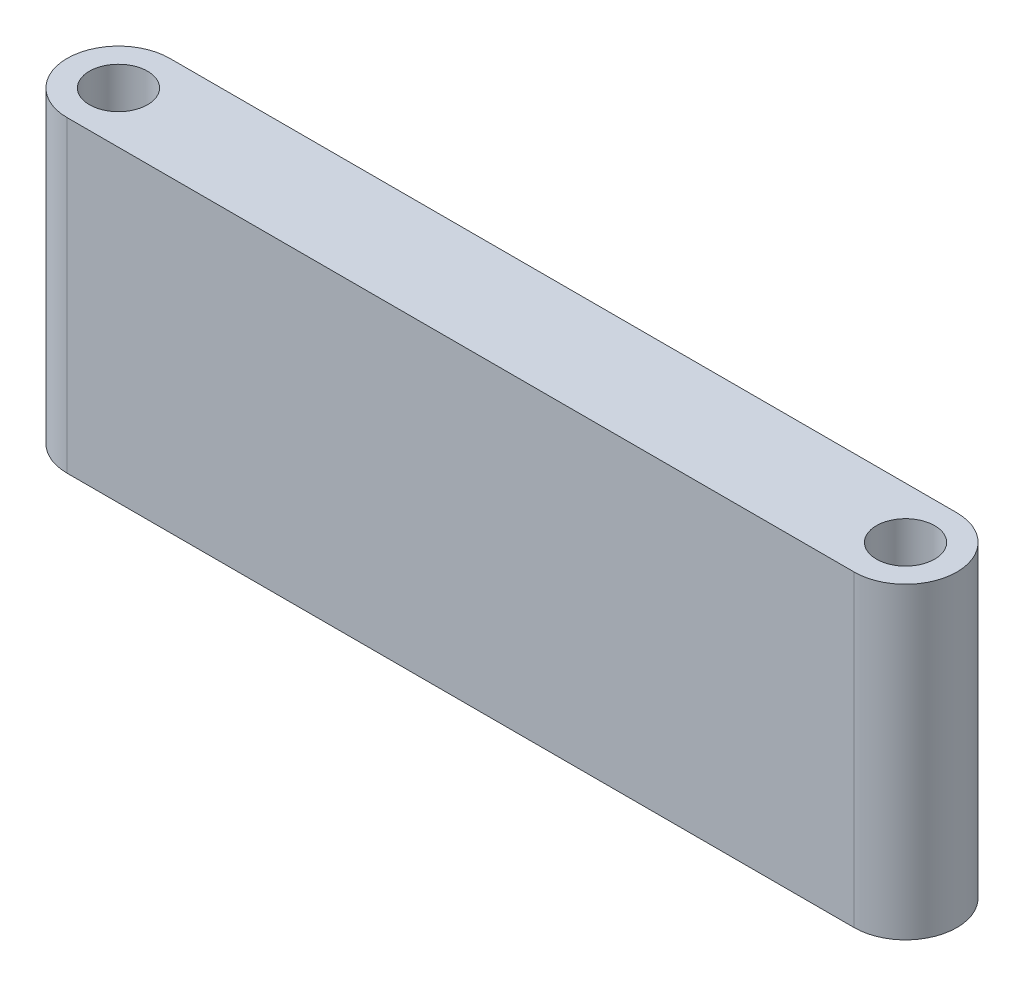
ISO-10303-21;
HEADER;
FILE_DESCRIPTION(('STEP AP214'),'2;1');
FILE_NAME('part.step','',(''),(''),'','','');
FILE_SCHEMA(('AUTOMOTIVE_DESIGN { 1 0 10303 214 1 1 1 1 }'));
ENDSEC;
DATA;
#1=APPLICATION_CONTEXT('core data for automotive mechanical design processes');
#2=APPLICATION_PROTOCOL_DEFINITION('international standard','automotive_design',2000,#1);
#3=PRODUCT_CONTEXT('',#1,'mechanical');
#4=PRODUCT('Part','Part','',(#3));
#5=PRODUCT_RELATED_PRODUCT_CATEGORY('part','',(#4));
#6=PRODUCT_DEFINITION_FORMATION('','',#4);
#7=PRODUCT_DEFINITION_CONTEXT('part definition',#1,'design');
#8=PRODUCT_DEFINITION('design','',#6,#7);
#9=PRODUCT_DEFINITION_SHAPE('','',#8);
#10=(LENGTH_UNIT() NAMED_UNIT(*) SI_UNIT(.MILLI.,.METRE.));
#11=(NAMED_UNIT(*) PLANE_ANGLE_UNIT() SI_UNIT($,.RADIAN.));
#12=(NAMED_UNIT(*) SI_UNIT($,.STERADIAN.) SOLID_ANGLE_UNIT());
#13=UNCERTAINTY_MEASURE_WITH_UNIT(LENGTH_MEASURE(1.E-05),#10,'distance_accuracy_value','');
#14=(GEOMETRIC_REPRESENTATION_CONTEXT(3) GLOBAL_UNCERTAINTY_ASSIGNED_CONTEXT((#13)) GLOBAL_UNIT_ASSIGNED_CONTEXT((#10,
#11,#12)) REPRESENTATION_CONTEXT('',''));
#15=CARTESIAN_POINT('',(0.,0.,0.));
#16=DIRECTION('',(0.,0.,1.));
#17=DIRECTION('',(1.,0.,0.));
#18=AXIS2_PLACEMENT_3D('',#15,#16,#17);
#19=CARTESIAN_POINT('',(-23.,18.,0.));
#20=DIRECTION('',(0.,1.,0.));
#21=DIRECTION('',(0.,0.,1.));
#22=AXIS2_PLACEMENT_3D('',#19,#20,#21);
#23=PLANE('',#22);
#24=CARTESIAN_POINT('',(23.,18.,0.));
#25=DIRECTION('',(0.,1.,0.));
#26=DIRECTION('',(0.,0.,1.));
#27=AXIS2_PLACEMENT_3D('',#24,#25,#26);
#28=CIRCLE('',#27,1.7);
#29=CARTESIAN_POINT('',(23.,18.,1.69999999999999));
#30=VERTEX_POINT('',#29);
#31=EDGE_CURVE('E107',#30,#30,#28,.T.);
#32=ORIENTED_EDGE('',*,*,#31,.F.);
#33=EDGE_LOOP('',(#32));
#34=FACE_BOUND('',#33,.T.);
#35=CARTESIAN_POINT('',(-23.,18.,0.));
#36=DIRECTION('',(0.,1.,0.));
#37=DIRECTION('',(0.,0.,1.));
#38=AXIS2_PLACEMENT_3D('',#35,#36,#37);
#39=CIRCLE('',#38,3.);
#40=CARTESIAN_POINT('',(-23.,18.,-3.));
#41=VERTEX_POINT('',#40);
#42=CARTESIAN_POINT('',(-23.,18.,3.));
#43=VERTEX_POINT('',#42);
#44=EDGE_CURVE('E91',#41,#43,#39,.T.);
#45=ORIENTED_EDGE('',*,*,#44,.T.);
#46=DIRECTION('',(1.,0.,0.));
#47=VECTOR('',#46,1.);
#48=CARTESIAN_POINT('',(-23.,18.,3.));
#49=LINE('',#48,#47);
#50=CARTESIAN_POINT('',(23.,18.,2.99999999999999));
#51=VERTEX_POINT('',#50);
#52=EDGE_CURVE('E86',#43,#51,#49,.T.);
#53=ORIENTED_EDGE('',*,*,#52,.T.);
#54=CARTESIAN_POINT('',(23.,18.,0.));
#55=DIRECTION('',(0.,1.,0.));
#56=DIRECTION('',(0.,0.,1.));
#57=AXIS2_PLACEMENT_3D('',#54,#55,#56);
#58=CIRCLE('',#57,3.);
#59=CARTESIAN_POINT('',(23.,18.,-3.00000000000001));
#60=VERTEX_POINT('',#59);
#61=EDGE_CURVE('E93',#51,#60,#58,.T.);
#62=ORIENTED_EDGE('',*,*,#61,.T.);
#63=DIRECTION('',(-1.,0.,0.));
#64=VECTOR('',#63,1.);
#65=CARTESIAN_POINT('',(-23.,18.,-3.));
#66=LINE('',#65,#64);
#67=EDGE_CURVE('E59',#60,#41,#66,.T.);
#68=ORIENTED_EDGE('',*,*,#67,.T.);
#69=EDGE_LOOP('',(#45,#53,#62,#68));
#70=FACE_BOUND('',#69,.T.);
#71=CARTESIAN_POINT('',(-23.,18.,0.));
#72=DIRECTION('',(0.,1.,0.));
#73=DIRECTION('',(0.,0.,1.));
#74=AXIS2_PLACEMENT_3D('',#71,#72,#73);
#75=CIRCLE('',#74,1.7);
#76=CARTESIAN_POINT('',(-23.,18.,1.7));
#77=VERTEX_POINT('',#76);
#78=EDGE_CURVE('E123',#77,#77,#75,.T.);
#79=ORIENTED_EDGE('',*,*,#78,.F.);
#80=EDGE_LOOP('',(#79));
#81=FACE_BOUND('',#80,.T.);
#82=ADVANCED_FACE('F41',(#34,#70,#81),#23,.T.);
#83=CARTESIAN_POINT('',(-23.,0.,0.));
#84=DIRECTION('',(0.,1.,0.));
#85=DIRECTION('',(0.,0.,1.));
#86=AXIS2_PLACEMENT_3D('',#83,#84,#85);
#87=PLANE('',#86);
#88=CARTESIAN_POINT('',(-23.,0.,0.));
#89=DIRECTION('',(0.,1.,0.));
#90=DIRECTION('',(0.,0.,1.));
#91=AXIS2_PLACEMENT_3D('',#88,#89,#90);
#92=CIRCLE('',#91,3.);
#93=CARTESIAN_POINT('',(-23.,0.,-3.));
#94=VERTEX_POINT('',#93);
#95=CARTESIAN_POINT('',(-23.,0.,3.));
#96=VERTEX_POINT('',#95);
#97=EDGE_CURVE('E104',#94,#96,#92,.T.);
#98=ORIENTED_EDGE('',*,*,#97,.F.);
#99=DIRECTION('',(-1.,0.,0.));
#100=VECTOR('',#99,1.);
#101=CARTESIAN_POINT('',(-23.,0.,-3.));
#102=LINE('',#101,#100);
#103=CARTESIAN_POINT('',(23.,0.,-3.00000000000001));
#104=VERTEX_POINT('',#103);
#105=EDGE_CURVE('E82',#104,#94,#102,.T.);
#106=ORIENTED_EDGE('',*,*,#105,.F.);
#107=CARTESIAN_POINT('',(23.,0.,0.));
#108=DIRECTION('',(0.,1.,0.));
#109=DIRECTION('',(0.,0.,1.));
#110=AXIS2_PLACEMENT_3D('',#107,#108,#109);
#111=CIRCLE('',#110,3.);
#112=CARTESIAN_POINT('',(23.,0.,2.99999999999999));
#113=VERTEX_POINT('',#112);
#114=EDGE_CURVE('E73',#113,#104,#111,.T.);
#115=ORIENTED_EDGE('',*,*,#114,.F.);
#116=DIRECTION('',(1.,0.,0.));
#117=VECTOR('',#116,1.);
#118=CARTESIAN_POINT('',(-23.,0.,3.));
#119=LINE('',#118,#117);
#120=EDGE_CURVE('E100',#96,#113,#119,.T.);
#121=ORIENTED_EDGE('',*,*,#120,.F.);
#122=EDGE_LOOP('',(#98,#106,#115,#121));
#123=FACE_BOUND('',#122,.T.);
#124=CARTESIAN_POINT('',(23.,0.,0.));
#125=DIRECTION('',(0.,1.,0.));
#126=DIRECTION('',(0.,0.,1.));
#127=AXIS2_PLACEMENT_3D('',#124,#125,#126);
#128=CIRCLE('',#127,1.7);
#129=CARTESIAN_POINT('',(23.,0.,1.69999999999999));
#130=VERTEX_POINT('',#129);
#131=EDGE_CURVE('E119',#130,#130,#128,.T.);
#132=ORIENTED_EDGE('',*,*,#131,.T.);
#133=EDGE_LOOP('',(#132));
#134=FACE_BOUND('',#133,.T.);
#135=CARTESIAN_POINT('',(-23.,0.,0.));
#136=DIRECTION('',(0.,1.,0.));
#137=DIRECTION('',(0.,0.,1.));
#138=AXIS2_PLACEMENT_3D('',#135,#136,#137);
#139=CIRCLE('',#138,1.7);
#140=CARTESIAN_POINT('',(-23.,0.,1.7));
#141=VERTEX_POINT('',#140);
#142=EDGE_CURVE('E127',#141,#141,#139,.T.);
#143=ORIENTED_EDGE('',*,*,#142,.T.);
#144=EDGE_LOOP('',(#143));
#145=FACE_BOUND('',#144,.T.);
#146=ADVANCED_FACE('F116',(#123,#134,#145),#87,.F.);
#147=CARTESIAN_POINT('',(-23.,18.,0.));
#148=DIRECTION('',(0.,-1.,0.));
#149=DIRECTION('',(0.,0.,-1.));
#150=AXIS2_PLACEMENT_3D('',#147,#148,#149);
#151=CYLINDRICAL_SURFACE('',#150,3.);
#152=ORIENTED_EDGE('',*,*,#97,.T.);
#153=DIRECTION('',(0.,-1.,0.));
#154=VECTOR('',#153,1.);
#155=CARTESIAN_POINT('',(-23.,18.,3.));
#156=LINE('',#155,#154);
#157=EDGE_CURVE('E11',#43,#96,#156,.T.);
#158=ORIENTED_EDGE('',*,*,#157,.F.);
#159=ORIENTED_EDGE('',*,*,#44,.F.);
#160=DIRECTION('',(0.,-1.,0.));
#161=VECTOR('',#160,1.);
#162=CARTESIAN_POINT('',(-23.,18.,-3.));
#163=LINE('',#162,#161);
#164=EDGE_CURVE('E101',#41,#94,#163,.T.);
#165=ORIENTED_EDGE('',*,*,#164,.T.);
#166=EDGE_LOOP('',(#152,#158,#159,#165));
#167=FACE_BOUND('',#166,.T.);
#168=ADVANCED_FACE('F43',(#167),#151,.T.);
#169=CARTESIAN_POINT('',(-23.,18.,3.));
#170=DIRECTION('',(0.,0.,-1.));
#171=DIRECTION('',(-1.,0.,0.));
#172=AXIS2_PLACEMENT_3D('',#169,#170,#171);
#173=PLANE('',#172);
#174=ORIENTED_EDGE('',*,*,#120,.T.);
#175=DIRECTION('',(0.,-1.,0.));
#176=VECTOR('',#175,1.);
#177=CARTESIAN_POINT('',(23.,18.,2.99999999999999));
#178=LINE('',#177,#176);
#179=EDGE_CURVE('E49',#51,#113,#178,.T.);
#180=ORIENTED_EDGE('',*,*,#179,.F.);
#181=ORIENTED_EDGE('',*,*,#52,.F.);
#182=ORIENTED_EDGE('',*,*,#157,.T.);
#183=EDGE_LOOP('',(#174,#180,#181,#182));
#184=FACE_BOUND('',#183,.T.);
#185=ADVANCED_FACE('F96',(#184),#173,.F.);
#186=CARTESIAN_POINT('',(23.,18.,0.));
#187=DIRECTION('',(0.,-1.,0.));
#188=DIRECTION('',(0.,0.,-1.));
#189=AXIS2_PLACEMENT_3D('',#186,#187,#188);
#190=CYLINDRICAL_SURFACE('',#189,3.);
#191=ORIENTED_EDGE('',*,*,#114,.T.);
#192=DIRECTION('',(0.,-1.,0.));
#193=VECTOR('',#192,1.);
#194=CARTESIAN_POINT('',(23.,18.,-3.00000000000001));
#195=LINE('',#194,#193);
#196=EDGE_CURVE('E98',#60,#104,#195,.T.);
#197=ORIENTED_EDGE('',*,*,#196,.F.);
#198=ORIENTED_EDGE('',*,*,#61,.F.);
#199=ORIENTED_EDGE('',*,*,#179,.T.);
#200=EDGE_LOOP('',(#191,#197,#198,#199));
#201=FACE_BOUND('',#200,.T.);
#202=ADVANCED_FACE('F97',(#201),#190,.T.);
#203=CARTESIAN_POINT('',(-23.,18.,-3.));
#204=DIRECTION('',(0.,0.,1.));
#205=DIRECTION('',(1.,0.,0.));
#206=AXIS2_PLACEMENT_3D('',#203,#204,#205);
#207=PLANE('',#206);
#208=ORIENTED_EDGE('',*,*,#105,.T.);
#209=ORIENTED_EDGE('',*,*,#164,.F.);
#210=ORIENTED_EDGE('',*,*,#67,.F.);
#211=ORIENTED_EDGE('',*,*,#196,.T.);
#212=EDGE_LOOP('',(#208,#209,#210,#211));
#213=FACE_BOUND('',#212,.T.);
#214=ADVANCED_FACE('F114',(#213),#207,.F.);
#215=CARTESIAN_POINT('',(23.,18.,0.));
#216=DIRECTION('',(0.,-1.,0.));
#217=DIRECTION('',(0.,0.,-1.));
#218=AXIS2_PLACEMENT_3D('',#215,#216,#217);
#219=CYLINDRICAL_SURFACE('',#218,1.7);
#220=ORIENTED_EDGE('',*,*,#31,.T.);
#221=EDGE_LOOP('',(#220));
#222=FACE_BOUND('',#221,.T.);
#223=ORIENTED_EDGE('',*,*,#131,.F.);
#224=EDGE_LOOP('',(#223));
#225=FACE_BOUND('',#224,.T.);
#226=ADVANCED_FACE('F141',(#222,#225),#219,.F.);
#227=CARTESIAN_POINT('',(-23.,18.,0.));
#228=DIRECTION('',(0.,-1.,0.));
#229=DIRECTION('',(0.,0.,-1.));
#230=AXIS2_PLACEMENT_3D('',#227,#228,#229);
#231=CYLINDRICAL_SURFACE('',#230,1.7);
#232=ORIENTED_EDGE('',*,*,#78,.T.);
#233=EDGE_LOOP('',(#232));
#234=FACE_BOUND('',#233,.T.);
#235=ORIENTED_EDGE('',*,*,#142,.F.);
#236=EDGE_LOOP('',(#235));
#237=FACE_BOUND('',#236,.T.);
#238=ADVANCED_FACE('F135',(#234,#237),#231,.F.);
#239=CLOSED_SHELL('',(#82,#146,#168,#185,#202,#214,#226,#238));
#240=MANIFOLD_SOLID_BREP('B2',#239);
#241=ADVANCED_BREP_SHAPE_REPRESENTATION('',(#18,#240),#14);
#242=SHAPE_DEFINITION_REPRESENTATION(#9,#241);
ENDSEC;
END-ISO-10303-21;
